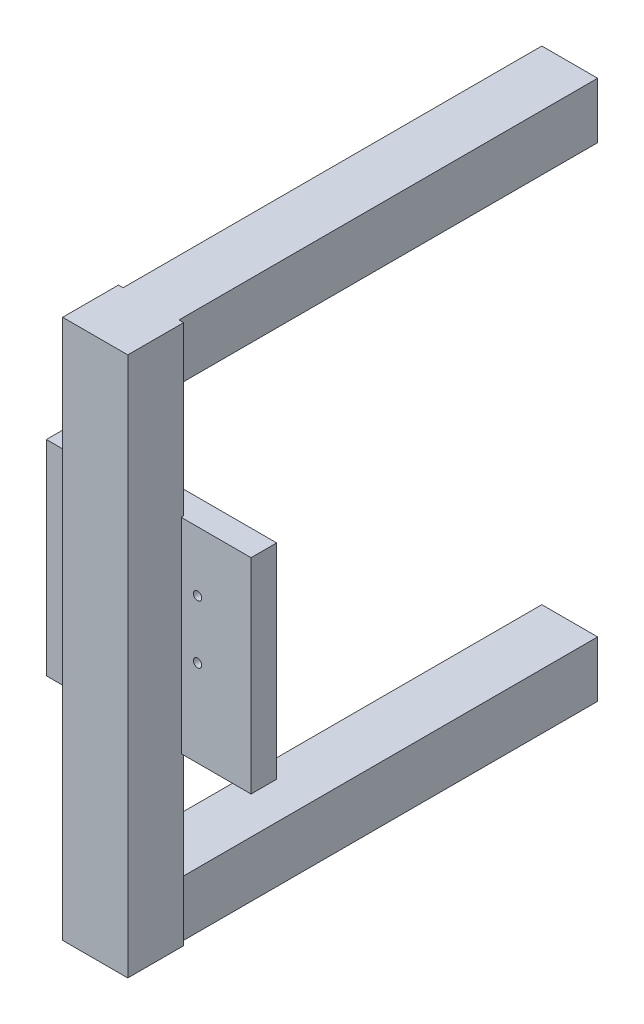
ISO-10303-21;
HEADER;
FILE_DESCRIPTION(('STEP AP214'),'2;1');
FILE_NAME('part.step','',(''),(''),'','','');
FILE_SCHEMA(('AUTOMOTIVE_DESIGN { 1 0 10303 214 1 1 1 1 }'));
ENDSEC;
DATA;
#1=APPLICATION_CONTEXT('core data for automotive mechanical design processes');
#2=APPLICATION_PROTOCOL_DEFINITION('international standard','automotive_design',2000,#1);
#3=PRODUCT_CONTEXT('',#1,'mechanical');
#4=PRODUCT('Part','Part','',(#3));
#5=PRODUCT_RELATED_PRODUCT_CATEGORY('part','',(#4));
#6=PRODUCT_DEFINITION_FORMATION('','',#4);
#7=PRODUCT_DEFINITION_CONTEXT('part definition',#1,'design');
#8=PRODUCT_DEFINITION('design','',#6,#7);
#9=PRODUCT_DEFINITION_SHAPE('','',#8);
#10=(LENGTH_UNIT() NAMED_UNIT(*) SI_UNIT(.MILLI.,.METRE.));
#11=(NAMED_UNIT(*) PLANE_ANGLE_UNIT() SI_UNIT($,.RADIAN.));
#12=(NAMED_UNIT(*) SI_UNIT($,.STERADIAN.) SOLID_ANGLE_UNIT());
#13=UNCERTAINTY_MEASURE_WITH_UNIT(LENGTH_MEASURE(1.E-05),#10,'distance_accuracy_value','');
#14=(GEOMETRIC_REPRESENTATION_CONTEXT(3) GLOBAL_UNCERTAINTY_ASSIGNED_CONTEXT((#13)) GLOBAL_UNIT_ASSIGNED_CONTEXT((#10,
#11,#12)) REPRESENTATION_CONTEXT('',''));
#15=CARTESIAN_POINT('',(0.,0.,0.));
#16=DIRECTION('',(0.,0.,1.));
#17=DIRECTION('',(1.,0.,0.));
#18=AXIS2_PLACEMENT_3D('',#15,#16,#17);
#19=CARTESIAN_POINT('',(0.,0.,128.));
#20=DIRECTION('',(0.,0.,-1.));
#21=DIRECTION('',(-1.,0.,0.));
#22=AXIS2_PLACEMENT_3D('',#19,#20,#21);
#23=PLANE('',#22);
#24=DIRECTION('',(0.,-1.,0.));
#25=VECTOR('',#24,1.);
#26=CARTESIAN_POINT('',(-2.,-22.,128.));
#27=LINE('',#26,#25);
#28=CARTESIAN_POINT('',(-2.,22.,128.));
#29=VERTEX_POINT('',#28);
#30=CARTESIAN_POINT('',(-2.,-22.,128.));
#31=VERTEX_POINT('',#30);
#32=EDGE_CURVE('E224',#29,#31,#27,.T.);
#33=ORIENTED_EDGE('',*,*,#32,.F.);
#34=DIRECTION('',(-1.,0.,0.));
#35=VECTOR('',#34,1.);
#36=CARTESIAN_POINT('',(-2.,22.,128.));
#37=LINE('',#36,#35);
#38=CARTESIAN_POINT('',(42.,22.,128.));
#39=VERTEX_POINT('',#38);
#40=EDGE_CURVE('E240',#39,#29,#37,.T.);
#41=ORIENTED_EDGE('',*,*,#40,.F.);
#42=DIRECTION('',(0.,1.,0.));
#43=VECTOR('',#42,1.);
#44=CARTESIAN_POINT('',(42.,-22.,128.));
#45=LINE('',#44,#43);
#46=CARTESIAN_POINT('',(42.,-22.,128.));
#47=VERTEX_POINT('',#46);
#48=EDGE_CURVE('E250',#47,#39,#45,.T.);
#49=ORIENTED_EDGE('',*,*,#48,.F.);
#50=DIRECTION('',(1.,0.,0.));
#51=VECTOR('',#50,1.);
#52=CARTESIAN_POINT('',(-2.,-22.,128.));
#53=LINE('',#52,#51);
#54=EDGE_CURVE('E230',#31,#47,#53,.T.);
#55=ORIENTED_EDGE('',*,*,#54,.F.);
#56=EDGE_LOOP('',(#33,#41,#49,#55));
#57=FACE_BOUND('',#56,.T.);
#58=DIRECTION('',(-1.,0.,0.));
#59=VECTOR('',#58,1.);
#60=CARTESIAN_POINT('',(7.2,15.05,128.));
#61=LINE('',#60,#59);
#62=CARTESIAN_POINT('',(32.8,15.05,128.));
#63=VERTEX_POINT('',#62);
#64=CARTESIAN_POINT('',(7.2,15.05,128.));
#65=VERTEX_POINT('',#64);
#66=EDGE_CURVE('E217',#63,#65,#61,.T.);
#67=ORIENTED_EDGE('',*,*,#66,.T.);
#68=DIRECTION('',(0.,-1.,0.));
#69=VECTOR('',#68,1.);
#70=CARTESIAN_POINT('',(7.2,-9.25,128.));
#71=LINE('',#70,#69);
#72=CARTESIAN_POINT('',(7.2,-9.25,128.));
#73=VERTEX_POINT('',#72);
#74=EDGE_CURVE('E57',#65,#73,#71,.T.);
#75=ORIENTED_EDGE('',*,*,#74,.T.);
#76=DIRECTION('',(1.,0.,0.));
#77=VECTOR('',#76,1.);
#78=CARTESIAN_POINT('',(7.2,-9.25,128.));
#79=LINE('',#78,#77);
#80=CARTESIAN_POINT('',(32.8,-9.25,128.));
#81=VERTEX_POINT('',#80);
#82=EDGE_CURVE('E225',#73,#81,#79,.T.);
#83=ORIENTED_EDGE('',*,*,#82,.T.);
#84=DIRECTION('',(0.,1.,0.));
#85=VECTOR('',#84,1.);
#86=CARTESIAN_POINT('',(32.8,-9.25,128.));
#87=LINE('',#86,#85);
#88=EDGE_CURVE('E406',#81,#63,#87,.T.);
#89=ORIENTED_EDGE('',*,*,#88,.T.);
#90=EDGE_LOOP('',(#67,#75,#83,#89));
#91=FACE_BOUND('',#90,.T.);
#92=ADVANCED_FACE('F39',(#57,#91),#23,.T.);
#93=CARTESIAN_POINT('',(0.,0.,133.));
#94=DIRECTION('',(0.,0.,-1.));
#95=DIRECTION('',(-1.,0.,0.));
#96=AXIS2_PLACEMENT_3D('',#93,#94,#95);
#97=PLANE('',#96);
#98=DIRECTION('',(0.,-1.,0.));
#99=VECTOR('',#98,1.);
#100=CARTESIAN_POINT('',(13.,-58.,133.));
#101=LINE('',#100,#99);
#102=CARTESIAN_POINT('',(13.,-22.,133.));
#103=VERTEX_POINT('',#102);
#104=CARTESIAN_POINT('',(13.,-58.,133.));
#105=VERTEX_POINT('',#104);
#106=EDGE_CURVE('E316',#103,#105,#101,.T.);
#107=ORIENTED_EDGE('',*,*,#106,.F.);
#108=DIRECTION('',(1.,0.,0.));
#109=VECTOR('',#108,1.);
#110=CARTESIAN_POINT('',(0.,-22.,133.));
#111=LINE('',#110,#109);
#112=CARTESIAN_POINT('',(27.,-22.,133.));
#113=VERTEX_POINT('',#112);
#114=EDGE_CURVE('E268',#103,#113,#111,.T.);
#115=ORIENTED_EDGE('',*,*,#114,.T.);
#116=DIRECTION('',(0.,1.,0.));
#117=VECTOR('',#116,1.);
#118=CARTESIAN_POINT('',(27.,-58.,133.));
#119=LINE('',#118,#117);
#120=CARTESIAN_POINT('',(27.,-58.,133.));
#121=VERTEX_POINT('',#120);
#122=EDGE_CURVE('E333',#121,#113,#119,.T.);
#123=ORIENTED_EDGE('',*,*,#122,.F.);
#124=DIRECTION('',(1.,0.,0.));
#125=VECTOR('',#124,1.);
#126=CARTESIAN_POINT('',(13.,-58.,133.));
#127=LINE('',#126,#125);
#128=CARTESIAN_POINT('',(26.,-58.,133.));
#129=VERTEX_POINT('',#128);
#130=EDGE_CURVE('E329',#129,#121,#127,.T.);
#131=ORIENTED_EDGE('',*,*,#130,.F.);
#132=DIRECTION('',(0.,1.,0.));
#133=VECTOR('',#132,1.);
#134=CARTESIAN_POINT('',(26.,0.,133.));
#135=LINE('',#134,#133);
#136=CARTESIAN_POINT('',(26.,-46.,133.));
#137=VERTEX_POINT('',#136);
#138=EDGE_CURVE('E352',#129,#137,#135,.T.);
#139=ORIENTED_EDGE('',*,*,#138,.T.);
#140=DIRECTION('',(-1.,0.,0.));
#141=VECTOR('',#140,1.);
#142=CARTESIAN_POINT('',(0.,-46.,133.));
#143=LINE('',#142,#141);
#144=CARTESIAN_POINT('',(14.,-46.,133.));
#145=VERTEX_POINT('',#144);
#146=EDGE_CURVE('E355',#137,#145,#143,.T.);
#147=ORIENTED_EDGE('',*,*,#146,.T.);
#148=DIRECTION('',(0.,-1.,0.));
#149=VECTOR('',#148,1.);
#150=CARTESIAN_POINT('',(14.,0.,133.));
#151=LINE('',#150,#149);
#152=CARTESIAN_POINT('',(14.,-58.,133.));
#153=VERTEX_POINT('',#152);
#154=EDGE_CURVE('E357',#145,#153,#151,.T.);
#155=ORIENTED_EDGE('',*,*,#154,.T.);
#156=EDGE_CURVE('E332',#105,#153,#127,.T.);
#157=ORIENTED_EDGE('',*,*,#156,.F.);
#158=EDGE_LOOP('',(#107,#115,#123,#131,#139,#147,#155,#157));
#159=FACE_BOUND('',#158,.T.);
#160=ADVANCED_FACE('F425',(#159),#97,.T.);
#161=CARTESIAN_POINT('',(27.,22.,133.));
#162=VERTEX_POINT('',#161);
#163=CARTESIAN_POINT('',(27.,58.,133.));
#164=VERTEX_POINT('',#163);
#165=EDGE_CURVE('E331',#162,#164,#119,.T.);
#166=ORIENTED_EDGE('',*,*,#165,.F.);
#167=DIRECTION('',(-1.,0.,0.));
#168=VECTOR('',#167,1.);
#169=CARTESIAN_POINT('',(0.,22.,133.));
#170=LINE('',#169,#168);
#171=CARTESIAN_POINT('',(13.,22.,133.));
#172=VERTEX_POINT('',#171);
#173=EDGE_CURVE('E264',#162,#172,#170,.T.);
#174=ORIENTED_EDGE('',*,*,#173,.T.);
#175=CARTESIAN_POINT('',(13.,58.,133.));
#176=VERTEX_POINT('',#175);
#177=EDGE_CURVE('E327',#176,#172,#101,.T.);
#178=ORIENTED_EDGE('',*,*,#177,.F.);
#179=DIRECTION('',(-1.,0.,0.));
#180=VECTOR('',#179,1.);
#181=CARTESIAN_POINT('',(13.,58.,133.));
#182=LINE('',#181,#180);
#183=CARTESIAN_POINT('',(14.,58.,133.));
#184=VERTEX_POINT('',#183);
#185=EDGE_CURVE('E336',#184,#176,#182,.T.);
#186=ORIENTED_EDGE('',*,*,#185,.F.);
#187=DIRECTION('',(0.,-1.,0.));
#188=VECTOR('',#187,1.);
#189=CARTESIAN_POINT('',(14.,0.,133.));
#190=LINE('',#189,#188);
#191=CARTESIAN_POINT('',(14.,46.,133.));
#192=VERTEX_POINT('',#191);
#193=EDGE_CURVE('E365',#184,#192,#190,.T.);
#194=ORIENTED_EDGE('',*,*,#193,.T.);
#195=DIRECTION('',(1.,0.,0.));
#196=VECTOR('',#195,1.);
#197=CARTESIAN_POINT('',(0.,46.,133.));
#198=LINE('',#197,#196);
#199=CARTESIAN_POINT('',(26.,46.,133.));
#200=VERTEX_POINT('',#199);
#201=EDGE_CURVE('E291',#192,#200,#198,.T.);
#202=ORIENTED_EDGE('',*,*,#201,.T.);
#203=DIRECTION('',(0.,1.,0.));
#204=VECTOR('',#203,1.);
#205=CARTESIAN_POINT('',(26.,0.,133.));
#206=LINE('',#205,#204);
#207=CARTESIAN_POINT('',(26.,58.,133.));
#208=VERTEX_POINT('',#207);
#209=EDGE_CURVE('E363',#200,#208,#206,.T.);
#210=ORIENTED_EDGE('',*,*,#209,.T.);
#211=EDGE_CURVE('E321',#164,#208,#182,.T.);
#212=ORIENTED_EDGE('',*,*,#211,.F.);
#213=EDGE_LOOP('',(#166,#174,#178,#186,#194,#202,#210,#212));
#214=FACE_BOUND('',#213,.T.);
#215=ADVANCED_FACE('F429',(#214),#97,.T.);
#216=CARTESIAN_POINT('',(13.,-58.,145.));
#217=DIRECTION('',(1.,0.,0.));
#218=DIRECTION('',(0.,0.,-1.));
#219=AXIS2_PLACEMENT_3D('',#216,#217,#218);
#220=PLANE('',#219);
#221=DIRECTION('',(0.,0.,1.));
#222=VECTOR('',#221,1.);
#223=CARTESIAN_POINT('',(13.,-22.,145.));
#224=LINE('',#223,#222);
#225=CARTESIAN_POINT('',(13.,-22.,133.5));
#226=VERTEX_POINT('',#225);
#227=EDGE_CURVE('E269',#103,#226,#224,.T.);
#228=ORIENTED_EDGE('',*,*,#227,.F.);
#229=ORIENTED_EDGE('',*,*,#106,.T.);
#230=DIRECTION('',(0.,0.,-1.));
#231=VECTOR('',#230,1.);
#232=CARTESIAN_POINT('',(13.,-58.,145.));
#233=LINE('',#232,#231);
#234=CARTESIAN_POINT('',(13.,-58.,145.));
#235=VERTEX_POINT('',#234);
#236=EDGE_CURVE('E349',#235,#105,#233,.T.);
#237=ORIENTED_EDGE('',*,*,#236,.F.);
#238=DIRECTION('',(0.,-1.,0.));
#239=VECTOR('',#238,1.);
#240=CARTESIAN_POINT('',(13.,-58.,145.));
#241=LINE('',#240,#239);
#242=CARTESIAN_POINT('',(13.,58.,145.));
#243=VERTEX_POINT('',#242);
#244=EDGE_CURVE('E320',#243,#235,#241,.T.);
#245=ORIENTED_EDGE('',*,*,#244,.F.);
#246=DIRECTION('',(0.,0.,-1.));
#247=VECTOR('',#246,1.);
#248=CARTESIAN_POINT('',(13.,58.,145.));
#249=LINE('',#248,#247);
#250=EDGE_CURVE('E330',#243,#176,#249,.T.);
#251=ORIENTED_EDGE('',*,*,#250,.T.);
#252=ORIENTED_EDGE('',*,*,#177,.T.);
#253=DIRECTION('',(0.,0.,-1.));
#254=VECTOR('',#253,1.);
#255=CARTESIAN_POINT('',(13.,22.,145.));
#256=LINE('',#255,#254);
#257=CARTESIAN_POINT('',(13.,22.,133.5));
#258=VERTEX_POINT('',#257);
#259=EDGE_CURVE('E64',#258,#172,#256,.T.);
#260=ORIENTED_EDGE('',*,*,#259,.F.);
#261=DIRECTION('',(0.,1.,0.));
#262=VECTOR('',#261,1.);
#263=CARTESIAN_POINT('',(13.,-58.,133.5));
#264=LINE('',#263,#262);
#265=EDGE_CURVE('E263',#226,#258,#264,.T.);
#266=ORIENTED_EDGE('',*,*,#265,.F.);
#267=EDGE_LOOP('',(#228,#229,#237,#245,#251,#252,#260,#266));
#268=FACE_BOUND('',#267,.T.);
#269=ADVANCED_FACE('F41',(#268),#220,.F.);
#270=CARTESIAN_POINT('',(27.,-58.,145.));
#271=DIRECTION('',(-1.,0.,0.));
#272=DIRECTION('',(0.,0.,1.));
#273=AXIS2_PLACEMENT_3D('',#270,#271,#272);
#274=PLANE('',#273);
#275=DIRECTION('',(0.,0.,-1.));
#276=VECTOR('',#275,1.);
#277=CARTESIAN_POINT('',(27.,-22.,145.));
#278=LINE('',#277,#276);
#279=CARTESIAN_POINT('',(27.,-22.,133.5));
#280=VERTEX_POINT('',#279);
#281=EDGE_CURVE('E11',#280,#113,#278,.T.);
#282=ORIENTED_EDGE('',*,*,#281,.F.);
#283=DIRECTION('',(0.,-1.,0.));
#284=VECTOR('',#283,1.);
#285=CARTESIAN_POINT('',(27.,-58.,133.5));
#286=LINE('',#285,#284);
#287=CARTESIAN_POINT('',(27.,22.,133.5));
#288=VERTEX_POINT('',#287);
#289=EDGE_CURVE('E370',#288,#280,#286,.T.);
#290=ORIENTED_EDGE('',*,*,#289,.F.);
#291=DIRECTION('',(0.,0.,1.));
#292=VECTOR('',#291,1.);
#293=CARTESIAN_POINT('',(27.,22.,145.));
#294=LINE('',#293,#292);
#295=EDGE_CURVE('E48',#162,#288,#294,.T.);
#296=ORIENTED_EDGE('',*,*,#295,.F.);
#297=ORIENTED_EDGE('',*,*,#165,.T.);
#298=DIRECTION('',(0.,0.,-1.));
#299=VECTOR('',#298,1.);
#300=CARTESIAN_POINT('',(27.,58.,145.));
#301=LINE('',#300,#299);
#302=CARTESIAN_POINT('',(27.,58.,145.));
#303=VERTEX_POINT('',#302);
#304=EDGE_CURVE('E342',#303,#164,#301,.T.);
#305=ORIENTED_EDGE('',*,*,#304,.F.);
#306=DIRECTION('',(0.,1.,0.));
#307=VECTOR('',#306,1.);
#308=CARTESIAN_POINT('',(27.,-58.,145.));
#309=LINE('',#308,#307);
#310=CARTESIAN_POINT('',(27.,-58.,145.));
#311=VERTEX_POINT('',#310);
#312=EDGE_CURVE('E323',#311,#303,#309,.T.);
#313=ORIENTED_EDGE('',*,*,#312,.F.);
#314=DIRECTION('',(0.,0.,-1.));
#315=VECTOR('',#314,1.);
#316=CARTESIAN_POINT('',(27.,-58.,145.));
#317=LINE('',#316,#315);
#318=EDGE_CURVE('E347',#311,#121,#317,.T.);
#319=ORIENTED_EDGE('',*,*,#318,.T.);
#320=ORIENTED_EDGE('',*,*,#122,.T.);
#321=EDGE_LOOP('',(#282,#290,#296,#297,#305,#313,#319,#320));
#322=FACE_BOUND('',#321,.T.);
#323=ADVANCED_FACE('F494',(#322),#274,.F.);
#324=CARTESIAN_POINT('',(13.,-58.,145.));
#325=DIRECTION('',(0.,1.,0.));
#326=DIRECTION('',(0.,0.,1.));
#327=AXIS2_PLACEMENT_3D('',#324,#325,#326);
#328=PLANE('',#327);
#329=ORIENTED_EDGE('',*,*,#318,.F.);
#330=DIRECTION('',(1.,0.,0.));
#331=VECTOR('',#330,1.);
#332=CARTESIAN_POINT('',(13.,-58.,145.));
#333=LINE('',#332,#331);
#334=EDGE_CURVE('E319',#235,#311,#333,.T.);
#335=ORIENTED_EDGE('',*,*,#334,.F.);
#336=ORIENTED_EDGE('',*,*,#236,.T.);
#337=ORIENTED_EDGE('',*,*,#156,.T.);
#338=DIRECTION('',(0.,0.,-1.));
#339=VECTOR('',#338,1.);
#340=CARTESIAN_POINT('',(14.,-58.,145.));
#341=LINE('',#340,#339);
#342=CARTESIAN_POINT('',(14.,-58.,43.));
#343=VERTEX_POINT('',#342);
#344=EDGE_CURVE('E314',#153,#343,#341,.T.);
#345=ORIENTED_EDGE('',*,*,#344,.T.);
#346=DIRECTION('',(1.,0.,0.));
#347=VECTOR('',#346,1.);
#348=CARTESIAN_POINT('',(14.,-58.,43.));
#349=LINE('',#348,#347);
#350=CARTESIAN_POINT('',(26.,-58.,43.));
#351=VERTEX_POINT('',#350);
#352=EDGE_CURVE('E299',#343,#351,#349,.T.);
#353=ORIENTED_EDGE('',*,*,#352,.T.);
#354=DIRECTION('',(0.,0.,-1.));
#355=VECTOR('',#354,1.);
#356=CARTESIAN_POINT('',(26.,-58.,145.));
#357=LINE('',#356,#355);
#358=EDGE_CURVE('E315',#129,#351,#357,.T.);
#359=ORIENTED_EDGE('',*,*,#358,.F.);
#360=ORIENTED_EDGE('',*,*,#130,.T.);
#361=EDGE_LOOP('',(#329,#335,#336,#337,#345,#353,#359,#360));
#362=FACE_BOUND('',#361,.T.);
#363=ADVANCED_FACE('F492',(#362),#328,.F.);
#364=CARTESIAN_POINT('',(13.,58.,145.));
#365=DIRECTION('',(0.,-1.,0.));
#366=DIRECTION('',(0.,0.,-1.));
#367=AXIS2_PLACEMENT_3D('',#364,#365,#366);
#368=PLANE('',#367);
#369=ORIENTED_EDGE('',*,*,#250,.F.);
#370=DIRECTION('',(-1.,0.,0.));
#371=VECTOR('',#370,1.);
#372=CARTESIAN_POINT('',(13.,58.,145.));
#373=LINE('',#372,#371);
#374=EDGE_CURVE('E324',#303,#243,#373,.T.);
#375=ORIENTED_EDGE('',*,*,#374,.F.);
#376=ORIENTED_EDGE('',*,*,#304,.T.);
#377=ORIENTED_EDGE('',*,*,#211,.T.);
#378=DIRECTION('',(0.,0.,-1.));
#379=VECTOR('',#378,1.);
#380=CARTESIAN_POINT('',(26.,58.,145.));
#381=LINE('',#380,#379);
#382=CARTESIAN_POINT('',(26.,58.,43.));
#383=VERTEX_POINT('',#382);
#384=EDGE_CURVE('E289',#208,#383,#381,.T.);
#385=ORIENTED_EDGE('',*,*,#384,.T.);
#386=DIRECTION('',(-1.,0.,0.));
#387=VECTOR('',#386,1.);
#388=CARTESIAN_POINT('',(14.,58.,43.));
#389=LINE('',#388,#387);
#390=CARTESIAN_POINT('',(14.,58.,43.));
#391=VERTEX_POINT('',#390);
#392=EDGE_CURVE('E285',#383,#391,#389,.T.);
#393=ORIENTED_EDGE('',*,*,#392,.T.);
#394=DIRECTION('',(0.,0.,-1.));
#395=VECTOR('',#394,1.);
#396=CARTESIAN_POINT('',(14.,58.,145.));
#397=LINE('',#396,#395);
#398=EDGE_CURVE('E282',#184,#391,#397,.T.);
#399=ORIENTED_EDGE('',*,*,#398,.F.);
#400=ORIENTED_EDGE('',*,*,#185,.T.);
#401=EDGE_LOOP('',(#369,#375,#376,#377,#385,#393,#399,#400));
#402=FACE_BOUND('',#401,.T.);
#403=ADVANCED_FACE('F488',(#402),#368,.F.);
#404=CARTESIAN_POINT('',(0.,0.,145.));
#405=DIRECTION('',(0.,0.,-1.));
#406=DIRECTION('',(-1.,0.,0.));
#407=AXIS2_PLACEMENT_3D('',#404,#405,#406);
#408=PLANE('',#407);
#409=ORIENTED_EDGE('',*,*,#374,.T.);
#410=ORIENTED_EDGE('',*,*,#244,.T.);
#411=ORIENTED_EDGE('',*,*,#334,.T.);
#412=ORIENTED_EDGE('',*,*,#312,.T.);
#413=EDGE_LOOP('',(#409,#410,#411,#412));
#414=FACE_BOUND('',#413,.T.);
#415=ADVANCED_FACE('F484',(#414),#408,.F.);
#416=CARTESIAN_POINT('',(14.,-58.,145.));
#417=DIRECTION('',(1.,0.,0.));
#418=DIRECTION('',(0.,0.,-1.));
#419=AXIS2_PLACEMENT_3D('',#416,#417,#418);
#420=PLANE('',#419);
#421=ORIENTED_EDGE('',*,*,#154,.F.);
#422=DIRECTION('',(0.,0.,-1.));
#423=VECTOR('',#422,1.);
#424=CARTESIAN_POINT('',(14.,-46.,145.));
#425=LINE('',#424,#423);
#426=CARTESIAN_POINT('',(14.,-46.,43.));
#427=VERTEX_POINT('',#426);
#428=EDGE_CURVE('E306',#145,#427,#425,.T.);
#429=ORIENTED_EDGE('',*,*,#428,.T.);
#430=DIRECTION('',(0.,-1.,0.));
#431=VECTOR('',#430,1.);
#432=CARTESIAN_POINT('',(14.,-58.,43.));
#433=LINE('',#432,#431);
#434=EDGE_CURVE('E298',#427,#343,#433,.T.);
#435=ORIENTED_EDGE('',*,*,#434,.T.);
#436=ORIENTED_EDGE('',*,*,#344,.F.);
#437=EDGE_LOOP('',(#421,#429,#435,#436));
#438=FACE_BOUND('',#437,.T.);
#439=ADVANCED_FACE('F481',(#438),#420,.F.);
#440=CARTESIAN_POINT('',(26.,-58.,145.));
#441=DIRECTION('',(-1.,0.,0.));
#442=DIRECTION('',(0.,0.,1.));
#443=AXIS2_PLACEMENT_3D('',#440,#441,#442);
#444=PLANE('',#443);
#445=ORIENTED_EDGE('',*,*,#138,.F.);
#446=ORIENTED_EDGE('',*,*,#358,.T.);
#447=DIRECTION('',(0.,1.,0.));
#448=VECTOR('',#447,1.);
#449=CARTESIAN_POINT('',(26.,-58.,43.));
#450=LINE('',#449,#448);
#451=CARTESIAN_POINT('',(26.,-46.,43.));
#452=VERTEX_POINT('',#451);
#453=EDGE_CURVE('E304',#351,#452,#450,.T.);
#454=ORIENTED_EDGE('',*,*,#453,.T.);
#455=DIRECTION('',(0.,0.,-1.));
#456=VECTOR('',#455,1.);
#457=CARTESIAN_POINT('',(26.,-46.,145.));
#458=LINE('',#457,#456);
#459=EDGE_CURVE('E309',#137,#452,#458,.T.);
#460=ORIENTED_EDGE('',*,*,#459,.F.);
#461=EDGE_LOOP('',(#445,#446,#454,#460));
#462=FACE_BOUND('',#461,.T.);
#463=ADVANCED_FACE('F480',(#462),#444,.F.);
#464=CARTESIAN_POINT('',(14.,-46.,145.));
#465=DIRECTION('',(0.,-1.,0.));
#466=DIRECTION('',(0.,0.,-1.));
#467=AXIS2_PLACEMENT_3D('',#464,#465,#466);
#468=PLANE('',#467);
#469=ORIENTED_EDGE('',*,*,#146,.F.);
#470=ORIENTED_EDGE('',*,*,#459,.T.);
#471=DIRECTION('',(-1.,0.,0.));
#472=VECTOR('',#471,1.);
#473=CARTESIAN_POINT('',(14.,-46.,43.));
#474=LINE('',#473,#472);
#475=EDGE_CURVE('E301',#452,#427,#474,.T.);
#476=ORIENTED_EDGE('',*,*,#475,.T.);
#477=ORIENTED_EDGE('',*,*,#428,.F.);
#478=EDGE_LOOP('',(#469,#470,#476,#477));
#479=FACE_BOUND('',#478,.T.);
#480=ADVANCED_FACE('F471',(#479),#468,.F.);
#481=CARTESIAN_POINT('',(0.,0.,43.));
#482=DIRECTION('',(0.,0.,-1.));
#483=DIRECTION('',(-1.,0.,0.));
#484=AXIS2_PLACEMENT_3D('',#481,#482,#483);
#485=PLANE('',#484);
#486=ORIENTED_EDGE('',*,*,#434,.F.);
#487=ORIENTED_EDGE('',*,*,#475,.F.);
#488=ORIENTED_EDGE('',*,*,#453,.F.);
#489=ORIENTED_EDGE('',*,*,#352,.F.);
#490=EDGE_LOOP('',(#486,#487,#488,#489));
#491=FACE_BOUND('',#490,.T.);
#492=ADVANCED_FACE('F470',(#491),#485,.T.);
#493=CARTESIAN_POINT('',(14.,46.,145.));
#494=DIRECTION('',(1.,0.,0.));
#495=DIRECTION('',(0.,0.,-1.));
#496=AXIS2_PLACEMENT_3D('',#493,#494,#495);
#497=PLANE('',#496);
#498=ORIENTED_EDGE('',*,*,#193,.F.);
#499=ORIENTED_EDGE('',*,*,#398,.T.);
#500=DIRECTION('',(0.,-1.,0.));
#501=VECTOR('',#500,1.);
#502=CARTESIAN_POINT('',(14.,46.,43.));
#503=LINE('',#502,#501);
#504=CARTESIAN_POINT('',(14.,46.,43.));
#505=VERTEX_POINT('',#504);
#506=EDGE_CURVE('E272',#391,#505,#503,.T.);
#507=ORIENTED_EDGE('',*,*,#506,.T.);
#508=DIRECTION('',(0.,0.,-1.));
#509=VECTOR('',#508,1.);
#510=CARTESIAN_POINT('',(14.,46.,145.));
#511=LINE('',#510,#509);
#512=EDGE_CURVE('E292',#192,#505,#511,.T.);
#513=ORIENTED_EDGE('',*,*,#512,.F.);
#514=EDGE_LOOP('',(#498,#499,#507,#513));
#515=FACE_BOUND('',#514,.T.);
#516=ADVANCED_FACE('F462',(#515),#497,.F.);
#517=CARTESIAN_POINT('',(14.,46.,145.));
#518=DIRECTION('',(0.,1.,0.));
#519=DIRECTION('',(0.,0.,1.));
#520=AXIS2_PLACEMENT_3D('',#517,#518,#519);
#521=PLANE('',#520);
#522=ORIENTED_EDGE('',*,*,#201,.F.);
#523=ORIENTED_EDGE('',*,*,#512,.T.);
#524=DIRECTION('',(1.,0.,0.));
#525=VECTOR('',#524,1.);
#526=CARTESIAN_POINT('',(14.,46.,43.));
#527=LINE('',#526,#525);
#528=CARTESIAN_POINT('',(26.,46.,43.));
#529=VERTEX_POINT('',#528);
#530=EDGE_CURVE('E277',#505,#529,#527,.T.);
#531=ORIENTED_EDGE('',*,*,#530,.T.);
#532=DIRECTION('',(0.,0.,-1.));
#533=VECTOR('',#532,1.);
#534=CARTESIAN_POINT('',(26.,46.,145.));
#535=LINE('',#534,#533);
#536=EDGE_CURVE('E290',#200,#529,#535,.T.);
#537=ORIENTED_EDGE('',*,*,#536,.F.);
#538=EDGE_LOOP('',(#522,#523,#531,#537));
#539=FACE_BOUND('',#538,.T.);
#540=ADVANCED_FACE('F463',(#539),#521,.F.);
#541=CARTESIAN_POINT('',(26.,46.,145.));
#542=DIRECTION('',(-1.,0.,0.));
#543=DIRECTION('',(0.,0.,1.));
#544=AXIS2_PLACEMENT_3D('',#541,#542,#543);
#545=PLANE('',#544);
#546=ORIENTED_EDGE('',*,*,#209,.F.);
#547=ORIENTED_EDGE('',*,*,#536,.T.);
#548=DIRECTION('',(0.,1.,0.));
#549=VECTOR('',#548,1.);
#550=CARTESIAN_POINT('',(26.,46.,43.));
#551=LINE('',#550,#549);
#552=EDGE_CURVE('E276',#529,#383,#551,.T.);
#553=ORIENTED_EDGE('',*,*,#552,.T.);
#554=ORIENTED_EDGE('',*,*,#384,.F.);
#555=EDGE_LOOP('',(#546,#547,#553,#554));
#556=FACE_BOUND('',#555,.T.);
#557=ADVANCED_FACE('F460',(#556),#545,.F.);
#558=CARTESIAN_POINT('',(0.,0.,43.));
#559=DIRECTION('',(0.,0.,-1.));
#560=DIRECTION('',(-1.,0.,0.));
#561=AXIS2_PLACEMENT_3D('',#558,#559,#560);
#562=PLANE('',#561);
#563=ORIENTED_EDGE('',*,*,#506,.F.);
#564=ORIENTED_EDGE('',*,*,#392,.F.);
#565=ORIENTED_EDGE('',*,*,#552,.F.);
#566=ORIENTED_EDGE('',*,*,#530,.F.);
#567=EDGE_LOOP('',(#563,#564,#565,#566));
#568=FACE_BOUND('',#567,.T.);
#569=ADVANCED_FACE('F449',(#568),#562,.T.);
#570=CARTESIAN_POINT('',(-2.,-22.,133.5));
#571=DIRECTION('',(0.,1.,0.));
#572=DIRECTION('',(0.,0.,1.));
#573=AXIS2_PLACEMENT_3D('',#570,#571,#572);
#574=PLANE('',#573);
#575=ORIENTED_EDGE('',*,*,#114,.F.);
#576=ORIENTED_EDGE('',*,*,#227,.T.);
#577=DIRECTION('',(1.,0.,0.));
#578=VECTOR('',#577,1.);
#579=CARTESIAN_POINT('',(-2.,-22.,133.5));
#580=LINE('',#579,#578);
#581=CARTESIAN_POINT('',(-2.,-22.,133.5));
#582=VERTEX_POINT('',#581);
#583=EDGE_CURVE('E236',#582,#226,#580,.T.);
#584=ORIENTED_EDGE('',*,*,#583,.F.);
#585=DIRECTION('',(0.,0.,-1.));
#586=VECTOR('',#585,1.);
#587=CARTESIAN_POINT('',(-2.,-22.,133.5));
#588=LINE('',#587,#586);
#589=EDGE_CURVE('E257',#582,#31,#588,.T.);
#590=ORIENTED_EDGE('',*,*,#589,.T.);
#591=ORIENTED_EDGE('',*,*,#54,.T.);
#592=DIRECTION('',(0.,0.,-1.));
#593=VECTOR('',#592,1.);
#594=CARTESIAN_POINT('',(42.,-22.,133.5));
#595=LINE('',#594,#593);
#596=CARTESIAN_POINT('',(42.,-22.,133.5));
#597=VERTEX_POINT('',#596);
#598=EDGE_CURVE('E260',#597,#47,#595,.T.);
#599=ORIENTED_EDGE('',*,*,#598,.F.);
#600=EDGE_CURVE('E237',#280,#597,#580,.T.);
#601=ORIENTED_EDGE('',*,*,#600,.F.);
#602=ORIENTED_EDGE('',*,*,#281,.T.);
#603=EDGE_LOOP('',(#575,#576,#584,#590,#591,#599,#601,#602));
#604=FACE_BOUND('',#603,.T.);
#605=ADVANCED_FACE('F442',(#604),#574,.F.);
#606=CARTESIAN_POINT('',(-2.,22.,133.5));
#607=DIRECTION('',(0.,-1.,0.));
#608=DIRECTION('',(0.,0.,-1.));
#609=AXIS2_PLACEMENT_3D('',#606,#607,#608);
#610=PLANE('',#609);
#611=DIRECTION('',(-1.,0.,0.));
#612=VECTOR('',#611,1.);
#613=CARTESIAN_POINT('',(-2.,22.,133.5));
#614=LINE('',#613,#612);
#615=CARTESIAN_POINT('',(-2.,22.,133.5));
#616=VERTEX_POINT('',#615);
#617=EDGE_CURVE('E241',#258,#616,#614,.T.);
#618=ORIENTED_EDGE('',*,*,#617,.F.);
#619=ORIENTED_EDGE('',*,*,#259,.T.);
#620=ORIENTED_EDGE('',*,*,#173,.F.);
#621=ORIENTED_EDGE('',*,*,#295,.T.);
#622=CARTESIAN_POINT('',(42.,22.,133.5));
#623=VERTEX_POINT('',#622);
#624=EDGE_CURVE('E244',#623,#288,#614,.T.);
#625=ORIENTED_EDGE('',*,*,#624,.F.);
#626=DIRECTION('',(0.,0.,-1.));
#627=VECTOR('',#626,1.);
#628=CARTESIAN_POINT('',(42.,22.,133.5));
#629=LINE('',#628,#627);
#630=EDGE_CURVE('E255',#623,#39,#629,.T.);
#631=ORIENTED_EDGE('',*,*,#630,.T.);
#632=ORIENTED_EDGE('',*,*,#40,.T.);
#633=DIRECTION('',(0.,0.,-1.));
#634=VECTOR('',#633,1.);
#635=CARTESIAN_POINT('',(-2.,22.,133.5));
#636=LINE('',#635,#634);
#637=EDGE_CURVE('E248',#616,#29,#636,.T.);
#638=ORIENTED_EDGE('',*,*,#637,.F.);
#639=EDGE_LOOP('',(#618,#619,#620,#621,#625,#631,#632,#638));
#640=FACE_BOUND('',#639,.T.);
#641=ADVANCED_FACE('F437',(#640),#610,.F.);
#642=CARTESIAN_POINT('',(0.,0.,133.5));
#643=DIRECTION('',(0.,0.,-1.));
#644=DIRECTION('',(-1.,0.,0.));
#645=AXIS2_PLACEMENT_3D('',#642,#643,#644);
#646=PLANE('',#645);
#647=CARTESIAN_POINT('',(9.5,9.15,133.5));
#648=DIRECTION('',(0.,0.,-1.));
#649=DIRECTION('',(-1.,0.,0.));
#650=AXIS2_PLACEMENT_3D('',#647,#648,#649);
#651=CIRCLE('',#650,0.9);
#652=CARTESIAN_POINT('',(8.6,9.15,133.5));
#653=VERTEX_POINT('',#652);
#654=EDGE_CURVE('E379',#653,#653,#651,.F.);
#655=ORIENTED_EDGE('',*,*,#654,.F.);
#656=EDGE_LOOP('',(#655));
#657=FACE_BOUND('',#656,.T.);
#658=CARTESIAN_POINT('',(9.5,-3.35,133.5));
#659=DIRECTION('',(0.,0.,-1.));
#660=DIRECTION('',(-1.,0.,0.));
#661=AXIS2_PLACEMENT_3D('',#658,#659,#660);
#662=CIRCLE('',#661,0.9);
#663=CARTESIAN_POINT('',(8.6,-3.35,133.5));
#664=VERTEX_POINT('',#663);
#665=EDGE_CURVE('E377',#664,#664,#662,.F.);
#666=ORIENTED_EDGE('',*,*,#665,.F.);
#667=EDGE_LOOP('',(#666));
#668=FACE_BOUND('',#667,.T.);
#669=ORIENTED_EDGE('',*,*,#583,.T.);
#670=ORIENTED_EDGE('',*,*,#265,.T.);
#671=ORIENTED_EDGE('',*,*,#617,.T.);
#672=DIRECTION('',(0.,-1.,0.));
#673=VECTOR('',#672,1.);
#674=CARTESIAN_POINT('',(-2.,-22.,133.5));
#675=LINE('',#674,#673);
#676=EDGE_CURVE('E232',#616,#582,#675,.T.);
#677=ORIENTED_EDGE('',*,*,#676,.T.);
#678=EDGE_LOOP('',(#669,#670,#671,#677));
#679=FACE_BOUND('',#678,.T.);
#680=ADVANCED_FACE('F436',(#657,#668,#679),#646,.F.);
#681=CARTESIAN_POINT('',(30.5,9.15,133.5));
#682=DIRECTION('',(0.,0.,-1.));
#683=DIRECTION('',(-1.,0.,0.));
#684=AXIS2_PLACEMENT_3D('',#681,#682,#683);
#685=CIRCLE('',#684,0.899999999999997);
#686=CARTESIAN_POINT('',(29.6,9.15,133.5));
#687=VERTEX_POINT('',#686);
#688=EDGE_CURVE('E387',#687,#687,#685,.F.);
#689=ORIENTED_EDGE('',*,*,#688,.F.);
#690=EDGE_LOOP('',(#689));
#691=FACE_BOUND('',#690,.T.);
#692=CARTESIAN_POINT('',(30.5,-3.35,133.5));
#693=DIRECTION('',(0.,0.,-1.));
#694=DIRECTION('',(-1.,0.,0.));
#695=AXIS2_PLACEMENT_3D('',#692,#693,#694);
#696=CIRCLE('',#695,0.899999999999997);
#697=CARTESIAN_POINT('',(29.6,-3.35,133.5));
#698=VERTEX_POINT('',#697);
#699=EDGE_CURVE('E382',#698,#698,#696,.F.);
#700=ORIENTED_EDGE('',*,*,#699,.F.);
#701=EDGE_LOOP('',(#700));
#702=FACE_BOUND('',#701,.T.);
#703=ORIENTED_EDGE('',*,*,#624,.T.);
#704=ORIENTED_EDGE('',*,*,#289,.T.);
#705=ORIENTED_EDGE('',*,*,#600,.T.);
#706=DIRECTION('',(0.,1.,0.));
#707=VECTOR('',#706,1.);
#708=CARTESIAN_POINT('',(42.,-22.,133.5));
#709=LINE('',#708,#707);
#710=EDGE_CURVE('E243',#597,#623,#709,.T.);
#711=ORIENTED_EDGE('',*,*,#710,.T.);
#712=EDGE_LOOP('',(#703,#704,#705,#711));
#713=FACE_BOUND('',#712,.T.);
#714=ADVANCED_FACE('F452',(#691,#702,#713),#646,.F.);
#715=CARTESIAN_POINT('',(-2.,-22.,133.5));
#716=DIRECTION('',(1.,0.,0.));
#717=DIRECTION('',(0.,0.,-1.));
#718=AXIS2_PLACEMENT_3D('',#715,#716,#717);
#719=PLANE('',#718);
#720=ORIENTED_EDGE('',*,*,#32,.T.);
#721=ORIENTED_EDGE('',*,*,#589,.F.);
#722=ORIENTED_EDGE('',*,*,#676,.F.);
#723=ORIENTED_EDGE('',*,*,#637,.T.);
#724=EDGE_LOOP('',(#720,#721,#722,#723));
#725=FACE_BOUND('',#724,.T.);
#726=ADVANCED_FACE('F443',(#725),#719,.F.);
#727=CARTESIAN_POINT('',(42.,-22.,133.5));
#728=DIRECTION('',(-1.,0.,0.));
#729=DIRECTION('',(0.,0.,1.));
#730=AXIS2_PLACEMENT_3D('',#727,#728,#729);
#731=PLANE('',#730);
#732=ORIENTED_EDGE('',*,*,#48,.T.);
#733=ORIENTED_EDGE('',*,*,#630,.F.);
#734=ORIENTED_EDGE('',*,*,#710,.F.);
#735=ORIENTED_EDGE('',*,*,#598,.T.);
#736=EDGE_LOOP('',(#732,#733,#734,#735));
#737=FACE_BOUND('',#736,.T.);
#738=ADVANCED_FACE('F444',(#737),#731,.F.);
#739=CARTESIAN_POINT('',(7.2,-9.25,129.6));
#740=DIRECTION('',(1.,0.,0.));
#741=DIRECTION('',(0.,0.,-1.));
#742=AXIS2_PLACEMENT_3D('',#739,#740,#741);
#743=PLANE('',#742);
#744=ORIENTED_EDGE('',*,*,#74,.F.);
#745=DIRECTION('',(0.,0.,-1.));
#746=VECTOR('',#745,1.);
#747=CARTESIAN_POINT('',(7.2,15.05,129.6));
#748=LINE('',#747,#746);
#749=CARTESIAN_POINT('',(7.2,15.05,129.6));
#750=VERTEX_POINT('',#749);
#751=EDGE_CURVE('E220',#750,#65,#748,.T.);
#752=ORIENTED_EDGE('',*,*,#751,.F.);
#753=DIRECTION('',(0.,-1.,0.));
#754=VECTOR('',#753,1.);
#755=CARTESIAN_POINT('',(7.2,-9.25,129.6));
#756=LINE('',#755,#754);
#757=CARTESIAN_POINT('',(7.2,-9.25,129.6));
#758=VERTEX_POINT('',#757);
#759=EDGE_CURVE('E207',#750,#758,#756,.T.);
#760=ORIENTED_EDGE('',*,*,#759,.T.);
#761=DIRECTION('',(0.,0.,-1.));
#762=VECTOR('',#761,1.);
#763=CARTESIAN_POINT('',(7.2,-9.25,129.6));
#764=LINE('',#763,#762);
#765=EDGE_CURVE('E216',#758,#73,#764,.T.);
#766=ORIENTED_EDGE('',*,*,#765,.T.);
#767=EDGE_LOOP('',(#744,#752,#760,#766));
#768=FACE_BOUND('',#767,.T.);
#769=ADVANCED_FACE('F214',(#768),#743,.T.);
#770=CARTESIAN_POINT('',(7.2,-9.25,129.6));
#771=DIRECTION('',(0.,1.,0.));
#772=DIRECTION('',(0.,0.,1.));
#773=AXIS2_PLACEMENT_3D('',#770,#771,#772);
#774=PLANE('',#773);
#775=ORIENTED_EDGE('',*,*,#82,.F.);
#776=ORIENTED_EDGE('',*,*,#765,.F.);
#777=DIRECTION('',(1.,0.,0.));
#778=VECTOR('',#777,1.);
#779=CARTESIAN_POINT('',(7.2,-9.25,129.6));
#780=LINE('',#779,#778);
#781=CARTESIAN_POINT('',(32.8,-9.25,129.6));
#782=VERTEX_POINT('',#781);
#783=EDGE_CURVE('E202',#758,#782,#780,.T.);
#784=ORIENTED_EDGE('',*,*,#783,.T.);
#785=DIRECTION('',(0.,0.,-1.));
#786=VECTOR('',#785,1.);
#787=CARTESIAN_POINT('',(32.8,-9.25,129.6));
#788=LINE('',#787,#786);
#789=EDGE_CURVE('E221',#782,#81,#788,.T.);
#790=ORIENTED_EDGE('',*,*,#789,.T.);
#791=EDGE_LOOP('',(#775,#776,#784,#790));
#792=FACE_BOUND('',#791,.T.);
#793=ADVANCED_FACE('F219',(#792),#774,.T.);
#794=CARTESIAN_POINT('',(32.8,-9.25,129.6));
#795=DIRECTION('',(-1.,0.,0.));
#796=DIRECTION('',(0.,0.,1.));
#797=AXIS2_PLACEMENT_3D('',#794,#795,#796);
#798=PLANE('',#797);
#799=ORIENTED_EDGE('',*,*,#88,.F.);
#800=ORIENTED_EDGE('',*,*,#789,.F.);
#801=DIRECTION('',(0.,1.,0.));
#802=VECTOR('',#801,1.);
#803=CARTESIAN_POINT('',(32.8,-9.25,129.6));
#804=LINE('',#803,#802);
#805=CARTESIAN_POINT('',(32.8,15.05,129.6));
#806=VERTEX_POINT('',#805);
#807=EDGE_CURVE('E209',#782,#806,#804,.T.);
#808=ORIENTED_EDGE('',*,*,#807,.T.);
#809=DIRECTION('',(0.,0.,-1.));
#810=VECTOR('',#809,1.);
#811=CARTESIAN_POINT('',(32.8,15.05,129.6));
#812=LINE('',#811,#810);
#813=EDGE_CURVE('E229',#806,#63,#812,.T.);
#814=ORIENTED_EDGE('',*,*,#813,.T.);
#815=EDGE_LOOP('',(#799,#800,#808,#814));
#816=FACE_BOUND('',#815,.T.);
#817=ADVANCED_FACE('F417',(#816),#798,.T.);
#818=CARTESIAN_POINT('',(7.2,15.05,129.6));
#819=DIRECTION('',(0.,-1.,0.));
#820=DIRECTION('',(0.,0.,-1.));
#821=AXIS2_PLACEMENT_3D('',#818,#819,#820);
#822=PLANE('',#821);
#823=ORIENTED_EDGE('',*,*,#66,.F.);
#824=ORIENTED_EDGE('',*,*,#813,.F.);
#825=DIRECTION('',(-1.,0.,0.));
#826=VECTOR('',#825,1.);
#827=CARTESIAN_POINT('',(7.2,15.05,129.6));
#828=LINE('',#827,#826);
#829=EDGE_CURVE('E404',#806,#750,#828,.T.);
#830=ORIENTED_EDGE('',*,*,#829,.T.);
#831=ORIENTED_EDGE('',*,*,#751,.T.);
#832=EDGE_LOOP('',(#823,#824,#830,#831));
#833=FACE_BOUND('',#832,.T.);
#834=ADVANCED_FACE('F420',(#833),#822,.T.);
#835=CARTESIAN_POINT('',(0.,0.,129.6));
#836=DIRECTION('',(0.,0.,-1.));
#837=DIRECTION('',(-1.,0.,0.));
#838=AXIS2_PLACEMENT_3D('',#835,#836,#837);
#839=PLANE('',#838);
#840=CARTESIAN_POINT('',(30.5,9.15,129.6));
#841=DIRECTION('',(0.,0.,-1.));
#842=DIRECTION('',(-1.,0.,0.));
#843=AXIS2_PLACEMENT_3D('',#840,#841,#842);
#844=CIRCLE('',#843,0.899999999999997);
#845=CARTESIAN_POINT('',(29.6,9.15,129.6));
#846=VERTEX_POINT('',#845);
#847=EDGE_CURVE('E43',#846,#846,#844,.F.);
#848=ORIENTED_EDGE('',*,*,#847,.T.);
#849=EDGE_LOOP('',(#848));
#850=FACE_BOUND('',#849,.T.);
#851=CARTESIAN_POINT('',(30.5,-3.35,129.6));
#852=DIRECTION('',(0.,0.,-1.));
#853=DIRECTION('',(-1.,0.,0.));
#854=AXIS2_PLACEMENT_3D('',#851,#852,#853);
#855=CIRCLE('',#854,0.899999999999997);
#856=CARTESIAN_POINT('',(29.6,-3.35,129.6));
#857=VERTEX_POINT('',#856);
#858=EDGE_CURVE('E383',#857,#857,#855,.F.);
#859=ORIENTED_EDGE('',*,*,#858,.T.);
#860=EDGE_LOOP('',(#859));
#861=FACE_BOUND('',#860,.T.);
#862=CARTESIAN_POINT('',(9.5,9.15,129.6));
#863=DIRECTION('',(0.,0.,-1.));
#864=DIRECTION('',(-1.,0.,0.));
#865=AXIS2_PLACEMENT_3D('',#862,#863,#864);
#866=CIRCLE('',#865,0.9);
#867=CARTESIAN_POINT('',(8.6,9.15,129.6));
#868=VERTEX_POINT('',#867);
#869=EDGE_CURVE('E381',#868,#868,#866,.F.);
#870=ORIENTED_EDGE('',*,*,#869,.T.);
#871=EDGE_LOOP('',(#870));
#872=FACE_BOUND('',#871,.T.);
#873=CARTESIAN_POINT('',(9.5,-3.35,129.6));
#874=DIRECTION('',(0.,0.,-1.));
#875=DIRECTION('',(-1.,0.,0.));
#876=AXIS2_PLACEMENT_3D('',#873,#874,#875);
#877=CIRCLE('',#876,0.9);
#878=CARTESIAN_POINT('',(8.6,-3.35,129.6));
#879=VERTEX_POINT('',#878);
#880=EDGE_CURVE('E376',#879,#879,#877,.F.);
#881=ORIENTED_EDGE('',*,*,#880,.T.);
#882=EDGE_LOOP('',(#881));
#883=FACE_BOUND('',#882,.T.);
#884=CARTESIAN_POINT('',(20.,0.,129.6));
#885=DIRECTION('',(0.,0.,-1.));
#886=DIRECTION('',(-1.,0.,0.));
#887=AXIS2_PLACEMENT_3D('',#884,#885,#886);
#888=CIRCLE('',#887,5.);
#889=CARTESIAN_POINT('',(15.,0.,129.6));
#890=VERTEX_POINT('',#889);
#891=EDGE_CURVE('E375',#890,#890,#888,.F.);
#892=ORIENTED_EDGE('',*,*,#891,.T.);
#893=EDGE_LOOP('',(#892));
#894=FACE_BOUND('',#893,.T.);
#895=ORIENTED_EDGE('',*,*,#759,.F.);
#896=ORIENTED_EDGE('',*,*,#829,.F.);
#897=ORIENTED_EDGE('',*,*,#807,.F.);
#898=ORIENTED_EDGE('',*,*,#783,.F.);
#899=EDGE_LOOP('',(#895,#896,#897,#898));
#900=FACE_BOUND('',#899,.T.);
#901=ADVANCED_FACE('F210',(#850,#861,#872,#883,#894,#900),#839,.T.);
#902=CARTESIAN_POINT('',(20.,0.,134.));
#903=DIRECTION('',(0.,0.,-1.));
#904=DIRECTION('',(-1.,0.,0.));
#905=AXIS2_PLACEMENT_3D('',#902,#903,#904);
#906=CYLINDRICAL_SURFACE('',#905,5.);
#907=ORIENTED_EDGE('',*,*,#891,.F.);
#908=EDGE_LOOP('',(#907));
#909=FACE_BOUND('',#908,.T.);
#910=CARTESIAN_POINT('',(20.,0.,134.));
#911=DIRECTION('',(0.,0.,1.));
#912=DIRECTION('',(1.,0.,0.));
#913=AXIS2_PLACEMENT_3D('',#910,#911,#912);
#914=CIRCLE('',#913,5.);
#915=CARTESIAN_POINT('',(25.,0.,134.));
#916=VERTEX_POINT('',#915);
#917=EDGE_CURVE('E374',#916,#916,#914,.T.);
#918=ORIENTED_EDGE('',*,*,#917,.T.);
#919=EDGE_LOOP('',(#918));
#920=FACE_BOUND('',#919,.T.);
#921=ADVANCED_FACE('F617',(#909,#920),#906,.F.);
#922=CARTESIAN_POINT('',(20.,0.,134.));
#923=DIRECTION('',(0.,0.,1.));
#924=DIRECTION('',(1.,0.,0.));
#925=AXIS2_PLACEMENT_3D('',#922,#923,#924);
#926=PLANE('',#925);
#927=ORIENTED_EDGE('',*,*,#917,.F.);
#928=EDGE_LOOP('',(#927));
#929=FACE_BOUND('',#928,.T.);
#930=ADVANCED_FACE('F629',(#929),#926,.F.);
#931=CARTESIAN_POINT('',(9.5,-3.35,134.));
#932=DIRECTION('',(0.,0.,-1.));
#933=DIRECTION('',(-1.,0.,0.));
#934=AXIS2_PLACEMENT_3D('',#931,#932,#933);
#935=CYLINDRICAL_SURFACE('',#934,0.9);
#936=ORIENTED_EDGE('',*,*,#880,.F.);
#937=EDGE_LOOP('',(#936));
#938=FACE_BOUND('',#937,.T.);
#939=ORIENTED_EDGE('',*,*,#665,.T.);
#940=EDGE_LOOP('',(#939));
#941=FACE_BOUND('',#940,.T.);
#942=ADVANCED_FACE('F640',(#938,#941),#935,.F.);
#943=CARTESIAN_POINT('',(9.5,9.15,134.));
#944=DIRECTION('',(0.,0.,-1.));
#945=DIRECTION('',(-1.,0.,0.));
#946=AXIS2_PLACEMENT_3D('',#943,#944,#945);
#947=CYLINDRICAL_SURFACE('',#946,0.9);
#948=ORIENTED_EDGE('',*,*,#869,.F.);
#949=EDGE_LOOP('',(#948));
#950=FACE_BOUND('',#949,.T.);
#951=ORIENTED_EDGE('',*,*,#654,.T.);
#952=EDGE_LOOP('',(#951));
#953=FACE_BOUND('',#952,.T.);
#954=ADVANCED_FACE('F647',(#950,#953),#947,.F.);
#955=CARTESIAN_POINT('',(30.5,-3.35,134.));
#956=DIRECTION('',(0.,0.,-1.));
#957=DIRECTION('',(-1.,0.,0.));
#958=AXIS2_PLACEMENT_3D('',#955,#956,#957);
#959=CYLINDRICAL_SURFACE('',#958,0.899999999999997);
#960=ORIENTED_EDGE('',*,*,#858,.F.);
#961=EDGE_LOOP('',(#960));
#962=FACE_BOUND('',#961,.T.);
#963=ORIENTED_EDGE('',*,*,#699,.T.);
#964=EDGE_LOOP('',(#963));
#965=FACE_BOUND('',#964,.T.);
#966=ADVANCED_FACE('F659',(#962,#965),#959,.F.);
#967=CARTESIAN_POINT('',(30.5,9.15,134.));
#968=DIRECTION('',(0.,0.,-1.));
#969=DIRECTION('',(-1.,0.,0.));
#970=AXIS2_PLACEMENT_3D('',#967,#968,#969);
#971=CYLINDRICAL_SURFACE('',#970,0.899999999999997);
#972=ORIENTED_EDGE('',*,*,#847,.F.);
#973=EDGE_LOOP('',(#972));
#974=FACE_BOUND('',#973,.T.);
#975=ORIENTED_EDGE('',*,*,#688,.T.);
#976=EDGE_LOOP('',(#975));
#977=FACE_BOUND('',#976,.T.);
#978=ADVANCED_FACE('F667',(#974,#977),#971,.F.);
#979=CLOSED_SHELL('',(#92,#160,#215,#269,#323,#363,#403,#415,#439,#463,#480,#492,#516,#540,#557,
#569,#605,#641,#680,#714,#726,#738,#769,#793,#817,#834,#901,#921,#930,#942,#954,#966,#978));
#980=MANIFOLD_SOLID_BREP('B2',#979);
#981=ADVANCED_BREP_SHAPE_REPRESENTATION('',(#18,#980),#14);
#982=SHAPE_DEFINITION_REPRESENTATION(#9,#981);
ENDSEC;
END-ISO-10303-21;
